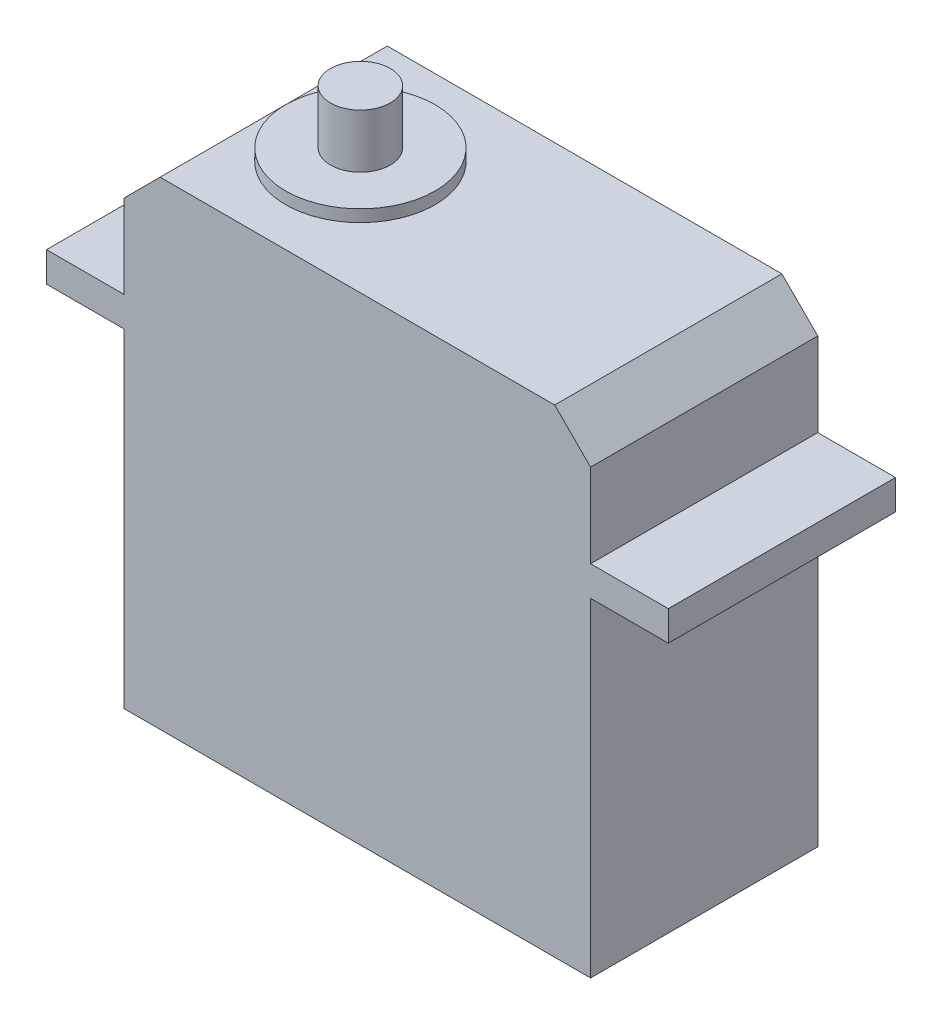
ISO-10303-21;
HEADER;
FILE_DESCRIPTION(('STEP AP214'),'2;1');
FILE_NAME('part.step','',(''),(''),'','','');
FILE_SCHEMA(('AUTOMOTIVE_DESIGN { 1 0 10303 214 1 1 1 1 }'));
ENDSEC;
DATA;
#1=APPLICATION_CONTEXT('core data for automotive mechanical design processes');
#2=APPLICATION_PROTOCOL_DEFINITION('international standard','automotive_design',2000,#1);
#3=PRODUCT_CONTEXT('',#1,'mechanical');
#4=PRODUCT('Part','Part','',(#3));
#5=PRODUCT_RELATED_PRODUCT_CATEGORY('part','',(#4));
#6=PRODUCT_DEFINITION_FORMATION('','',#4);
#7=PRODUCT_DEFINITION_CONTEXT('part definition',#1,'design');
#8=PRODUCT_DEFINITION('design','',#6,#7);
#9=PRODUCT_DEFINITION_SHAPE('','',#8);
#10=(LENGTH_UNIT() NAMED_UNIT(*) SI_UNIT(.MILLI.,.METRE.));
#11=(NAMED_UNIT(*) PLANE_ANGLE_UNIT() SI_UNIT($,.RADIAN.));
#12=(NAMED_UNIT(*) SI_UNIT($,.STERADIAN.) SOLID_ANGLE_UNIT());
#13=UNCERTAINTY_MEASURE_WITH_UNIT(LENGTH_MEASURE(1.E-05),#10,'distance_accuracy_value','');
#14=(GEOMETRIC_REPRESENTATION_CONTEXT(3) GLOBAL_UNCERTAINTY_ASSIGNED_CONTEXT((#13)) GLOBAL_UNIT_ASSIGNED_CONTEXT((#10,
#11,#12)) REPRESENTATION_CONTEXT('',''));
#15=CARTESIAN_POINT('',(0.,0.,0.));
#16=DIRECTION('',(0.,0.,1.));
#17=DIRECTION('',(1.,0.,0.));
#18=AXIS2_PLACEMENT_3D('',#15,#16,#17);
#19=CARTESIAN_POINT('',(0.,40.,0.));
#20=DIRECTION('',(1.,0.,0.));
#21=DIRECTION('',(0.,0.,-1.));
#22=AXIS2_PLACEMENT_3D('',#19,#20,#21);
#23=PLANE('',#22);
#24=DIRECTION('',(0.,-1.,0.));
#25=VECTOR('',#24,1.);
#26=CARTESIAN_POINT('',(0.,40.,0.));
#27=LINE('',#26,#25);
#28=CARTESIAN_POINT('',(0.,37.,0.));
#29=VERTEX_POINT('',#28);
#30=CARTESIAN_POINT('',(0.,30.,0.));
#31=VERTEX_POINT('',#30);
#32=EDGE_CURVE('E229',#29,#31,#27,.T.);
#33=ORIENTED_EDGE('',*,*,#32,.F.);
#34=DIRECTION('',(0.,0.,-1.));
#35=VECTOR('',#34,1.);
#36=CARTESIAN_POINT('',(0.,37.,0.));
#37=LINE('',#36,#35);
#38=CARTESIAN_POINT('',(0.,37.,-19.));
#39=VERTEX_POINT('',#38);
#40=EDGE_CURVE('E240',#29,#39,#37,.T.);
#41=ORIENTED_EDGE('',*,*,#40,.T.);
#42=DIRECTION('',(0.,-1.,0.));
#43=VECTOR('',#42,1.);
#44=CARTESIAN_POINT('',(0.,40.,-19.));
#45=LINE('',#44,#43);
#46=CARTESIAN_POINT('',(0.,30.,-19.));
#47=VERTEX_POINT('',#46);
#48=EDGE_CURVE('E220',#39,#47,#45,.T.);
#49=ORIENTED_EDGE('',*,*,#48,.T.);
#50=DIRECTION('',(0.,0.,-1.));
#51=VECTOR('',#50,1.);
#52=CARTESIAN_POINT('',(0.,30.,-19.));
#53=LINE('',#52,#51);
#54=EDGE_CURVE('E166',#31,#47,#53,.T.);
#55=ORIENTED_EDGE('',*,*,#54,.F.);
#56=EDGE_LOOP('',(#33,#41,#49,#55));
#57=FACE_BOUND('',#56,.T.);
#58=ADVANCED_FACE('F47',(#57),#23,.F.);
#59=DIRECTION('',(0.,0.,1.));
#60=VECTOR('',#59,1.);
#61=CARTESIAN_POINT('',(0.,27.5,-19.));
#62=LINE('',#61,#60);
#63=CARTESIAN_POINT('',(0.,27.5,-19.));
#64=VERTEX_POINT('',#63);
#65=CARTESIAN_POINT('',(0.,27.5,0.));
#66=VERTEX_POINT('',#65);
#67=EDGE_CURVE('E339',#64,#66,#62,.T.);
#68=ORIENTED_EDGE('',*,*,#67,.F.);
#69=CARTESIAN_POINT('',(0.,0.,-19.));
#70=VERTEX_POINT('',#69);
#71=EDGE_CURVE('E171',#64,#70,#45,.T.);
#72=ORIENTED_EDGE('',*,*,#71,.T.);
#73=DIRECTION('',(0.,0.,1.));
#74=VECTOR('',#73,1.);
#75=CARTESIAN_POINT('',(0.,0.,0.));
#76=LINE('',#75,#74);
#77=CARTESIAN_POINT('',(0.,0.,0.));
#78=VERTEX_POINT('',#77);
#79=EDGE_CURVE('E204',#70,#78,#76,.T.);
#80=ORIENTED_EDGE('',*,*,#79,.T.);
#81=EDGE_CURVE('E228',#66,#78,#27,.T.);
#82=ORIENTED_EDGE('',*,*,#81,.F.);
#83=EDGE_LOOP('',(#68,#72,#80,#82));
#84=FACE_BOUND('',#83,.T.);
#85=ADVANCED_FACE('F269',(#84),#23,.F.);
#86=CARTESIAN_POINT('',(39.,40.,0.));
#87=DIRECTION('',(-1.,0.,0.));
#88=DIRECTION('',(0.,0.,1.));
#89=AXIS2_PLACEMENT_3D('',#86,#87,#88);
#90=PLANE('',#89);
#91=DIRECTION('',(0.,-1.,0.));
#92=VECTOR('',#91,1.);
#93=CARTESIAN_POINT('',(39.,40.,-19.));
#94=LINE('',#93,#92);
#95=CARTESIAN_POINT('',(39.,37.,-19.));
#96=VERTEX_POINT('',#95);
#97=CARTESIAN_POINT('',(39.,30.,-19.));
#98=VERTEX_POINT('',#97);
#99=EDGE_CURVE('E223',#96,#98,#94,.T.);
#100=ORIENTED_EDGE('',*,*,#99,.F.);
#101=DIRECTION('',(0.,0.,1.));
#102=VECTOR('',#101,1.);
#103=CARTESIAN_POINT('',(39.,37.,0.));
#104=LINE('',#103,#102);
#105=CARTESIAN_POINT('',(39.,37.,0.));
#106=VERTEX_POINT('',#105);
#107=EDGE_CURVE('E56',#96,#106,#104,.T.);
#108=ORIENTED_EDGE('',*,*,#107,.T.);
#109=DIRECTION('',(0.,-1.,0.));
#110=VECTOR('',#109,1.);
#111=CARTESIAN_POINT('',(39.,40.,0.));
#112=LINE('',#111,#110);
#113=CARTESIAN_POINT('',(39.,30.,0.));
#114=VERTEX_POINT('',#113);
#115=EDGE_CURVE('E226',#106,#114,#112,.T.);
#116=ORIENTED_EDGE('',*,*,#115,.T.);
#117=DIRECTION('',(0.,0.,1.));
#118=VECTOR('',#117,1.);
#119=CARTESIAN_POINT('',(39.,30.,0.));
#120=LINE('',#119,#118);
#121=EDGE_CURVE('E175',#98,#114,#120,.T.);
#122=ORIENTED_EDGE('',*,*,#121,.F.);
#123=EDGE_LOOP('',(#100,#108,#116,#122));
#124=FACE_BOUND('',#123,.T.);
#125=ADVANCED_FACE('F275',(#124),#90,.F.);
#126=DIRECTION('',(0.,0.,-1.));
#127=VECTOR('',#126,1.);
#128=CARTESIAN_POINT('',(39.,27.5,0.));
#129=LINE('',#128,#127);
#130=CARTESIAN_POINT('',(39.,27.5,0.));
#131=VERTEX_POINT('',#130);
#132=CARTESIAN_POINT('',(39.,27.5,-19.));
#133=VERTEX_POINT('',#132);
#134=EDGE_CURVE('E172',#131,#133,#129,.T.);
#135=ORIENTED_EDGE('',*,*,#134,.F.);
#136=CARTESIAN_POINT('',(39.,0.,0.));
#137=VERTEX_POINT('',#136);
#138=EDGE_CURVE('E225',#131,#137,#112,.T.);
#139=ORIENTED_EDGE('',*,*,#138,.T.);
#140=DIRECTION('',(0.,0.,-1.));
#141=VECTOR('',#140,1.);
#142=CARTESIAN_POINT('',(39.,0.,0.));
#143=LINE('',#142,#141);
#144=CARTESIAN_POINT('',(39.,0.,-19.));
#145=VERTEX_POINT('',#144);
#146=EDGE_CURVE('E216',#137,#145,#143,.T.);
#147=ORIENTED_EDGE('',*,*,#146,.T.);
#148=EDGE_CURVE('E222',#133,#145,#94,.T.);
#149=ORIENTED_EDGE('',*,*,#148,.F.);
#150=EDGE_LOOP('',(#135,#139,#147,#149));
#151=FACE_BOUND('',#150,.T.);
#152=ADVANCED_FACE('F285',(#151),#90,.F.);
#153=CARTESIAN_POINT('',(0.,40.,0.));
#154=DIRECTION('',(0.,0.,-1.));
#155=DIRECTION('',(-1.,0.,0.));
#156=AXIS2_PLACEMENT_3D('',#153,#154,#155);
#157=PLANE('',#156);
#158=ORIENTED_EDGE('',*,*,#115,.F.);
#159=DIRECTION('',(0.707106781186548,-0.707106781186548,0.));
#160=VECTOR('',#159,1.);
#161=CARTESIAN_POINT('',(36.,40.,0.));
#162=LINE('',#161,#160);
#163=CARTESIAN_POINT('',(36.,40.,0.));
#164=VERTEX_POINT('',#163);
#165=EDGE_CURVE('E11',#106,#164,#162,.F.);
#166=ORIENTED_EDGE('',*,*,#165,.T.);
#167=DIRECTION('',(1.,0.,0.));
#168=VECTOR('',#167,1.);
#169=CARTESIAN_POINT('',(0.,40.,0.));
#170=LINE('',#169,#168);
#171=CARTESIAN_POINT('',(3.00000000000001,40.,0.));
#172=VERTEX_POINT('',#171);
#173=EDGE_CURVE('E205',#172,#164,#170,.T.);
#174=ORIENTED_EDGE('',*,*,#173,.F.);
#175=DIRECTION('',(0.707106781186546,0.707106781186549,0.));
#176=VECTOR('',#175,1.);
#177=CARTESIAN_POINT('',(3.00000000000001,40.,0.));
#178=LINE('',#177,#176);
#179=EDGE_CURVE('E238',#172,#29,#178,.F.);
#180=ORIENTED_EDGE('',*,*,#179,.T.);
#181=ORIENTED_EDGE('',*,*,#32,.T.);
#182=DIRECTION('',(1.,0.,0.));
#183=VECTOR('',#182,1.);
#184=CARTESIAN_POINT('',(-6.5,30.,0.));
#185=LINE('',#184,#183);
#186=CARTESIAN_POINT('',(-6.5,30.,0.));
#187=VERTEX_POINT('',#186);
#188=EDGE_CURVE('E177',#187,#31,#185,.T.);
#189=ORIENTED_EDGE('',*,*,#188,.F.);
#190=DIRECTION('',(0.,1.,0.));
#191=VECTOR('',#190,1.);
#192=CARTESIAN_POINT('',(-6.5,27.5,0.));
#193=LINE('',#192,#191);
#194=CARTESIAN_POINT('',(-6.5,27.5,0.));
#195=VERTEX_POINT('',#194);
#196=EDGE_CURVE('E157',#195,#187,#193,.T.);
#197=ORIENTED_EDGE('',*,*,#196,.F.);
#198=DIRECTION('',(1.,0.,0.));
#199=VECTOR('',#198,1.);
#200=CARTESIAN_POINT('',(-6.5,27.5,0.));
#201=LINE('',#200,#199);
#202=EDGE_CURVE('E154',#195,#66,#201,.T.);
#203=ORIENTED_EDGE('',*,*,#202,.T.);
#204=ORIENTED_EDGE('',*,*,#81,.T.);
#205=DIRECTION('',(1.,0.,0.));
#206=VECTOR('',#205,1.);
#207=CARTESIAN_POINT('',(0.,0.,0.));
#208=LINE('',#207,#206);
#209=EDGE_CURVE('E213',#78,#137,#208,.T.);
#210=ORIENTED_EDGE('',*,*,#209,.T.);
#211=ORIENTED_EDGE('',*,*,#138,.F.);
#212=DIRECTION('',(-1.,0.,0.));
#213=VECTOR('',#212,1.);
#214=CARTESIAN_POINT('',(45.5,27.5,0.));
#215=LINE('',#214,#213);
#216=CARTESIAN_POINT('',(45.5,27.5,0.));
#217=VERTEX_POINT('',#216);
#218=EDGE_CURVE('E201',#217,#131,#215,.T.);
#219=ORIENTED_EDGE('',*,*,#218,.F.);
#220=DIRECTION('',(0.,-1.,0.));
#221=VECTOR('',#220,1.);
#222=CARTESIAN_POINT('',(45.5,27.5,0.));
#223=LINE('',#222,#221);
#224=CARTESIAN_POINT('',(45.5,30.,0.));
#225=VERTEX_POINT('',#224);
#226=EDGE_CURVE('E181',#225,#217,#223,.T.);
#227=ORIENTED_EDGE('',*,*,#226,.F.);
#228=DIRECTION('',(-1.,0.,0.));
#229=VECTOR('',#228,1.);
#230=CARTESIAN_POINT('',(45.5,30.,0.));
#231=LINE('',#230,#229);
#232=EDGE_CURVE('E189',#225,#114,#231,.T.);
#233=ORIENTED_EDGE('',*,*,#232,.T.);
#234=EDGE_LOOP('',(#158,#166,#174,#180,#181,#189,#197,#203,#204,#210,#211,#219,#227,#233));
#235=FACE_BOUND('',#234,.T.);
#236=ADVANCED_FACE('F261',(#235),#157,.F.);
#237=CARTESIAN_POINT('',(0.,40.,-19.));
#238=DIRECTION('',(0.,0.,1.));
#239=DIRECTION('',(1.,0.,0.));
#240=AXIS2_PLACEMENT_3D('',#237,#238,#239);
#241=PLANE('',#240);
#242=DIRECTION('',(-1.,0.,0.));
#243=VECTOR('',#242,1.);
#244=CARTESIAN_POINT('',(0.,40.,-19.));
#245=LINE('',#244,#243);
#246=CARTESIAN_POINT('',(36.,40.,-19.));
#247=VERTEX_POINT('',#246);
#248=CARTESIAN_POINT('',(3.00000000000001,40.,-19.));
#249=VERTEX_POINT('',#248);
#250=EDGE_CURVE('E208',#247,#249,#245,.T.);
#251=ORIENTED_EDGE('',*,*,#250,.F.);
#252=DIRECTION('',(-0.707106781186548,0.707106781186548,0.));
#253=VECTOR('',#252,1.);
#254=CARTESIAN_POINT('',(36.,40.,-19.));
#255=LINE('',#254,#253);
#256=EDGE_CURVE('E70',#247,#96,#255,.F.);
#257=ORIENTED_EDGE('',*,*,#256,.T.);
#258=ORIENTED_EDGE('',*,*,#99,.T.);
#259=DIRECTION('',(-1.,0.,0.));
#260=VECTOR('',#259,1.);
#261=CARTESIAN_POINT('',(45.5,30.,-19.));
#262=LINE('',#261,#260);
#263=CARTESIAN_POINT('',(45.5,30.,-19.));
#264=VERTEX_POINT('',#263);
#265=EDGE_CURVE('E195',#264,#98,#262,.T.);
#266=ORIENTED_EDGE('',*,*,#265,.F.);
#267=DIRECTION('',(0.,1.,0.));
#268=VECTOR('',#267,1.);
#269=CARTESIAN_POINT('',(45.5,27.5,-19.));
#270=LINE('',#269,#268);
#271=CARTESIAN_POINT('',(45.5,27.5,-19.));
#272=VERTEX_POINT('',#271);
#273=EDGE_CURVE('E186',#272,#264,#270,.T.);
#274=ORIENTED_EDGE('',*,*,#273,.F.);
#275=DIRECTION('',(-1.,0.,0.));
#276=VECTOR('',#275,1.);
#277=CARTESIAN_POINT('',(45.5,27.5,-19.));
#278=LINE('',#277,#276);
#279=EDGE_CURVE('E198',#272,#133,#278,.T.);
#280=ORIENTED_EDGE('',*,*,#279,.T.);
#281=ORIENTED_EDGE('',*,*,#148,.T.);
#282=DIRECTION('',(-1.,0.,0.));
#283=VECTOR('',#282,1.);
#284=CARTESIAN_POINT('',(0.,0.,-19.));
#285=LINE('',#284,#283);
#286=EDGE_CURVE('E209',#145,#70,#285,.T.);
#287=ORIENTED_EDGE('',*,*,#286,.T.);
#288=ORIENTED_EDGE('',*,*,#71,.F.);
#289=DIRECTION('',(1.,0.,0.));
#290=VECTOR('',#289,1.);
#291=CARTESIAN_POINT('',(-6.5,27.5,-19.));
#292=LINE('',#291,#290);
#293=CARTESIAN_POINT('',(-6.5,27.5,-19.));
#294=VERTEX_POINT('',#293);
#295=EDGE_CURVE('E152',#294,#64,#292,.T.);
#296=ORIENTED_EDGE('',*,*,#295,.F.);
#297=DIRECTION('',(0.,-1.,0.));
#298=VECTOR('',#297,1.);
#299=CARTESIAN_POINT('',(-6.5,27.5,-19.));
#300=LINE('',#299,#298);
#301=CARTESIAN_POINT('',(-6.5,30.,-19.));
#302=VERTEX_POINT('',#301);
#303=EDGE_CURVE('E158',#302,#294,#300,.T.);
#304=ORIENTED_EDGE('',*,*,#303,.F.);
#305=DIRECTION('',(1.,0.,0.));
#306=VECTOR('',#305,1.);
#307=CARTESIAN_POINT('',(-6.5,30.,-19.));
#308=LINE('',#307,#306);
#309=EDGE_CURVE('E346',#302,#47,#308,.T.);
#310=ORIENTED_EDGE('',*,*,#309,.T.);
#311=ORIENTED_EDGE('',*,*,#48,.F.);
#312=DIRECTION('',(-0.707106781186546,-0.707106781186549,0.));
#313=VECTOR('',#312,1.);
#314=CARTESIAN_POINT('',(3.00000000000001,40.,-19.));
#315=LINE('',#314,#313);
#316=EDGE_CURVE('E242',#39,#249,#315,.F.);
#317=ORIENTED_EDGE('',*,*,#316,.T.);
#318=EDGE_LOOP('',(#251,#257,#258,#266,#274,#280,#281,#287,#288,#296,#304,#310,#311,#317));
#319=FACE_BOUND('',#318,.T.);
#320=ADVANCED_FACE('F169',(#319),#241,.F.);
#321=CARTESIAN_POINT('',(0.,40.,0.));
#322=DIRECTION('',(0.,-1.,0.));
#323=DIRECTION('',(0.,0.,-1.));
#324=AXIS2_PLACEMENT_3D('',#321,#322,#323);
#325=PLANE('',#324);
#326=CARTESIAN_POINT('',(10.25,40.,-9.5));
#327=DIRECTION('',(0.,-1.,0.));
#328=DIRECTION('',(0.,0.,-1.));
#329=AXIS2_PLACEMENT_3D('',#326,#327,#328);
#330=CIRCLE('',#329,6.25);
#331=CARTESIAN_POINT('',(10.25,40.,-15.75));
#332=VERTEX_POINT('',#331);
#333=EDGE_CURVE('E231',#332,#332,#330,.F.);
#334=ORIENTED_EDGE('',*,*,#333,.F.);
#335=EDGE_LOOP('',(#334));
#336=FACE_BOUND('',#335,.T.);
#337=ORIENTED_EDGE('',*,*,#173,.T.);
#338=DIRECTION('',(0.,0.,-1.));
#339=VECTOR('',#338,1.);
#340=CARTESIAN_POINT('',(36.,40.,0.));
#341=LINE('',#340,#339);
#342=EDGE_CURVE('E245',#164,#247,#341,.T.);
#343=ORIENTED_EDGE('',*,*,#342,.T.);
#344=ORIENTED_EDGE('',*,*,#250,.T.);
#345=DIRECTION('',(0.,0.,1.));
#346=VECTOR('',#345,1.);
#347=CARTESIAN_POINT('',(3.00000000000001,40.,0.));
#348=LINE('',#347,#346);
#349=EDGE_CURVE('E235',#249,#172,#348,.T.);
#350=ORIENTED_EDGE('',*,*,#349,.T.);
#351=EDGE_LOOP('',(#337,#343,#344,#350));
#352=FACE_BOUND('',#351,.T.);
#353=ADVANCED_FACE('F250',(#336,#352),#325,.F.);
#354=CARTESIAN_POINT('',(0.,0.,0.));
#355=DIRECTION('',(0.,-1.,0.));
#356=DIRECTION('',(0.,0.,-1.));
#357=AXIS2_PLACEMENT_3D('',#354,#355,#356);
#358=PLANE('',#357);
#359=ORIENTED_EDGE('',*,*,#79,.F.);
#360=ORIENTED_EDGE('',*,*,#286,.F.);
#361=ORIENTED_EDGE('',*,*,#146,.F.);
#362=ORIENTED_EDGE('',*,*,#209,.F.);
#363=EDGE_LOOP('',(#359,#360,#361,#362));
#364=FACE_BOUND('',#363,.T.);
#365=ADVANCED_FACE('F290',(#364),#358,.T.);
#366=CARTESIAN_POINT('',(45.5,27.5,0.));
#367=DIRECTION('',(0.,1.,0.));
#368=DIRECTION('',(0.,0.,1.));
#369=AXIS2_PLACEMENT_3D('',#366,#367,#368);
#370=PLANE('',#369);
#371=ORIENTED_EDGE('',*,*,#134,.T.);
#372=ORIENTED_EDGE('',*,*,#279,.F.);
#373=DIRECTION('',(0.,0.,-1.));
#374=VECTOR('',#373,1.);
#375=CARTESIAN_POINT('',(45.5,27.5,0.));
#376=LINE('',#375,#374);
#377=EDGE_CURVE('E184',#217,#272,#376,.T.);
#378=ORIENTED_EDGE('',*,*,#377,.F.);
#379=ORIENTED_EDGE('',*,*,#218,.T.);
#380=EDGE_LOOP('',(#371,#372,#378,#379));
#381=FACE_BOUND('',#380,.T.);
#382=ADVANCED_FACE('F293',(#381),#370,.F.);
#383=CARTESIAN_POINT('',(45.5,30.,0.));
#384=DIRECTION('',(0.,-1.,0.));
#385=DIRECTION('',(0.,0.,-1.));
#386=AXIS2_PLACEMENT_3D('',#383,#384,#385);
#387=PLANE('',#386);
#388=ORIENTED_EDGE('',*,*,#121,.T.);
#389=ORIENTED_EDGE('',*,*,#232,.F.);
#390=DIRECTION('',(0.,0.,1.));
#391=VECTOR('',#390,1.);
#392=CARTESIAN_POINT('',(45.5,30.,0.));
#393=LINE('',#392,#391);
#394=EDGE_CURVE('E188',#264,#225,#393,.T.);
#395=ORIENTED_EDGE('',*,*,#394,.F.);
#396=ORIENTED_EDGE('',*,*,#265,.T.);
#397=EDGE_LOOP('',(#388,#389,#395,#396));
#398=FACE_BOUND('',#397,.T.);
#399=ADVANCED_FACE('F300',(#398),#387,.F.);
#400=CARTESIAN_POINT('',(45.5,0.,0.));
#401=DIRECTION('',(-1.,0.,0.));
#402=DIRECTION('',(0.,0.,1.));
#403=AXIS2_PLACEMENT_3D('',#400,#401,#402);
#404=PLANE('',#403);
#405=ORIENTED_EDGE('',*,*,#226,.T.);
#406=ORIENTED_EDGE('',*,*,#377,.T.);
#407=ORIENTED_EDGE('',*,*,#273,.T.);
#408=ORIENTED_EDGE('',*,*,#394,.T.);
#409=EDGE_LOOP('',(#405,#406,#407,#408));
#410=FACE_BOUND('',#409,.T.);
#411=ADVANCED_FACE('F304',(#410),#404,.F.);
#412=CARTESIAN_POINT('',(-6.5,27.5,-19.));
#413=DIRECTION('',(0.,1.,0.));
#414=DIRECTION('',(0.,0.,1.));
#415=AXIS2_PLACEMENT_3D('',#412,#413,#414);
#416=PLANE('',#415);
#417=ORIENTED_EDGE('',*,*,#67,.T.);
#418=ORIENTED_EDGE('',*,*,#202,.F.);
#419=DIRECTION('',(0.,0.,1.));
#420=VECTOR('',#419,1.);
#421=CARTESIAN_POINT('',(-6.5,27.5,-19.));
#422=LINE('',#421,#420);
#423=EDGE_CURVE('E147',#294,#195,#422,.T.);
#424=ORIENTED_EDGE('',*,*,#423,.F.);
#425=ORIENTED_EDGE('',*,*,#295,.T.);
#426=EDGE_LOOP('',(#417,#418,#424,#425));
#427=FACE_BOUND('',#426,.T.);
#428=ADVANCED_FACE('F150',(#427),#416,.F.);
#429=CARTESIAN_POINT('',(-6.5,30.,-19.));
#430=DIRECTION('',(0.,-1.,0.));
#431=DIRECTION('',(0.,0.,-1.));
#432=AXIS2_PLACEMENT_3D('',#429,#430,#431);
#433=PLANE('',#432);
#434=ORIENTED_EDGE('',*,*,#54,.T.);
#435=ORIENTED_EDGE('',*,*,#309,.F.);
#436=DIRECTION('',(0.,0.,-1.));
#437=VECTOR('',#436,1.);
#438=CARTESIAN_POINT('',(-6.5,30.,-19.));
#439=LINE('',#438,#437);
#440=EDGE_CURVE('E163',#187,#302,#439,.T.);
#441=ORIENTED_EDGE('',*,*,#440,.F.);
#442=ORIENTED_EDGE('',*,*,#188,.T.);
#443=EDGE_LOOP('',(#434,#435,#441,#442));
#444=FACE_BOUND('',#443,.T.);
#445=ADVANCED_FACE('F311',(#444),#433,.F.);
#446=CARTESIAN_POINT('',(-6.5,0.,0.));
#447=DIRECTION('',(1.,0.,0.));
#448=DIRECTION('',(0.,0.,-1.));
#449=AXIS2_PLACEMENT_3D('',#446,#447,#448);
#450=PLANE('',#449);
#451=ORIENTED_EDGE('',*,*,#303,.T.);
#452=ORIENTED_EDGE('',*,*,#423,.T.);
#453=ORIENTED_EDGE('',*,*,#196,.T.);
#454=ORIENTED_EDGE('',*,*,#440,.T.);
#455=EDGE_LOOP('',(#451,#452,#453,#454));
#456=FACE_BOUND('',#455,.T.);
#457=ADVANCED_FACE('F161',(#456),#450,.F.);
#458=CARTESIAN_POINT('',(10.25,41.,-9.5));
#459=DIRECTION('',(0.,-1.,0.));
#460=DIRECTION('',(0.,0.,-1.));
#461=AXIS2_PLACEMENT_3D('',#458,#459,#460);
#462=CYLINDRICAL_SURFACE('',#461,6.25);
#463=CARTESIAN_POINT('',(10.25,41.,-9.5));
#464=DIRECTION('',(0.,1.,0.));
#465=DIRECTION('',(0.,0.,1.));
#466=AXIS2_PLACEMENT_3D('',#463,#464,#465);
#467=CIRCLE('',#466,6.25);
#468=CARTESIAN_POINT('',(10.25,41.,-3.25));
#469=VERTEX_POINT('',#468);
#470=EDGE_CURVE('E336',#469,#469,#467,.T.);
#471=ORIENTED_EDGE('',*,*,#470,.F.);
#472=EDGE_LOOP('',(#471));
#473=FACE_BOUND('',#472,.T.);
#474=ORIENTED_EDGE('',*,*,#333,.T.);
#475=EDGE_LOOP('',(#474));
#476=FACE_BOUND('',#475,.T.);
#477=ADVANCED_FACE('F317',(#473,#476),#462,.T.);
#478=CARTESIAN_POINT('',(10.25,41.,-9.5));
#479=DIRECTION('',(0.,1.,0.));
#480=DIRECTION('',(0.,0.,1.));
#481=AXIS2_PLACEMENT_3D('',#478,#479,#480);
#482=PLANE('',#481);
#483=CARTESIAN_POINT('',(10.25,41.,-9.5));
#484=DIRECTION('',(0.,1.,0.));
#485=DIRECTION('',(0.,0.,1.));
#486=AXIS2_PLACEMENT_3D('',#483,#484,#485);
#487=CIRCLE('',#486,2.5);
#488=CARTESIAN_POINT('',(10.25,41.,-7.));
#489=VERTEX_POINT('',#488);
#490=EDGE_CURVE('E234',#489,#489,#487,.T.);
#491=ORIENTED_EDGE('',*,*,#490,.F.);
#492=EDGE_LOOP('',(#491));
#493=FACE_BOUND('',#492,.T.);
#494=ORIENTED_EDGE('',*,*,#470,.T.);
#495=EDGE_LOOP('',(#494));
#496=FACE_BOUND('',#495,.T.);
#497=ADVANCED_FACE('F320',(#493,#496),#482,.T.);
#498=CARTESIAN_POINT('',(10.25,45.5,-9.5));
#499=DIRECTION('',(0.,-1.,0.));
#500=DIRECTION('',(0.,0.,-1.));
#501=AXIS2_PLACEMENT_3D('',#498,#499,#500);
#502=CYLINDRICAL_SURFACE('',#501,2.5);
#503=CARTESIAN_POINT('',(10.25,45.5,-9.5));
#504=DIRECTION('',(0.,1.,0.));
#505=DIRECTION('',(0.,0.,1.));
#506=AXIS2_PLACEMENT_3D('',#503,#504,#505);
#507=CIRCLE('',#506,2.5);
#508=CARTESIAN_POINT('',(10.25,45.5,-7.));
#509=VERTEX_POINT('',#508);
#510=EDGE_CURVE('E335',#509,#509,#507,.T.);
#511=ORIENTED_EDGE('',*,*,#510,.F.);
#512=EDGE_LOOP('',(#511));
#513=FACE_BOUND('',#512,.T.);
#514=ORIENTED_EDGE('',*,*,#490,.T.);
#515=EDGE_LOOP('',(#514));
#516=FACE_BOUND('',#515,.T.);
#517=ADVANCED_FACE('F324',(#513,#516),#502,.T.);
#518=CARTESIAN_POINT('',(10.25,45.5,-9.5));
#519=DIRECTION('',(0.,1.,0.));
#520=DIRECTION('',(0.,0.,1.));
#521=AXIS2_PLACEMENT_3D('',#518,#519,#520);
#522=PLANE('',#521);
#523=ORIENTED_EDGE('',*,*,#510,.T.);
#524=EDGE_LOOP('',(#523));
#525=FACE_BOUND('',#524,.T.);
#526=ADVANCED_FACE('F267',(#525),#522,.T.);
#527=CARTESIAN_POINT('',(3.00000000000001,40.,0.));
#528=DIRECTION('',(0.707106781186549,-0.707106781186546,0.));
#529=DIRECTION('',(0.,0.,1.));
#530=AXIS2_PLACEMENT_3D('',#527,#528,#529);
#531=PLANE('',#530);
#532=ORIENTED_EDGE('',*,*,#316,.F.);
#533=ORIENTED_EDGE('',*,*,#40,.F.);
#534=ORIENTED_EDGE('',*,*,#179,.F.);
#535=ORIENTED_EDGE('',*,*,#349,.F.);
#536=EDGE_LOOP('',(#532,#533,#534,#535));
#537=FACE_BOUND('',#536,.T.);
#538=ADVANCED_FACE('F259',(#537),#531,.F.);
#539=CARTESIAN_POINT('',(36.,40.,0.));
#540=DIRECTION('',(-0.707106781186547,-0.707106781186547,0.));
#541=DIRECTION('',(0.,0.,-1.));
#542=AXIS2_PLACEMENT_3D('',#539,#540,#541);
#543=PLANE('',#542);
#544=ORIENTED_EDGE('',*,*,#165,.F.);
#545=ORIENTED_EDGE('',*,*,#107,.F.);
#546=ORIENTED_EDGE('',*,*,#256,.F.);
#547=ORIENTED_EDGE('',*,*,#342,.F.);
#548=EDGE_LOOP('',(#544,#545,#546,#547));
#549=FACE_BOUND('',#548,.T.);
#550=ADVANCED_FACE('F50',(#549),#543,.F.);
#551=CLOSED_SHELL('',(#58,#85,#125,#152,#236,#320,#353,#365,#382,#399,#411,#428,#445,#457,#477,
#497,#517,#526,#538,#550));
#552=MANIFOLD_SOLID_BREP('B2',#551);
#553=ADVANCED_BREP_SHAPE_REPRESENTATION('',(#18,#552),#14);
#554=SHAPE_DEFINITION_REPRESENTATION(#9,#553);
ENDSEC;
END-ISO-10303-21;
